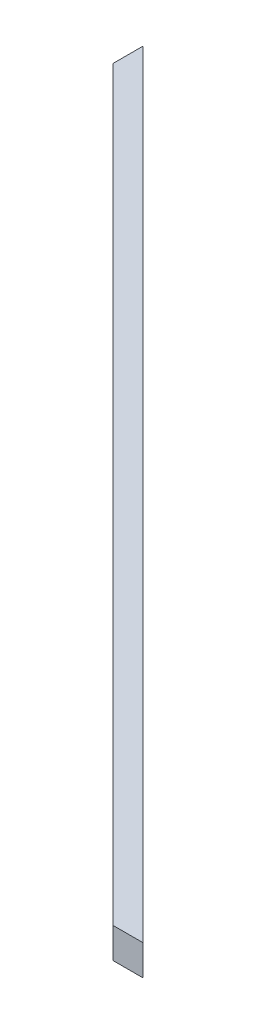
ISO-10303-21;
HEADER;
FILE_DESCRIPTION(('STEP AP214'),'2;1');
FILE_NAME('part.step','',(''),(''),'','','');
FILE_SCHEMA(('AUTOMOTIVE_DESIGN { 1 0 10303 214 1 1 1 1 }'));
ENDSEC;
DATA;
#1=APPLICATION_CONTEXT('core data for automotive mechanical design processes');
#2=APPLICATION_PROTOCOL_DEFINITION('international standard','automotive_design',2000,#1);
#3=PRODUCT_CONTEXT('',#1,'mechanical');
#4=PRODUCT('Part','Part','',(#3));
#5=PRODUCT_RELATED_PRODUCT_CATEGORY('part','',(#4));
#6=PRODUCT_DEFINITION_FORMATION('','',#4);
#7=PRODUCT_DEFINITION_CONTEXT('part definition',#1,'design');
#8=PRODUCT_DEFINITION('design','',#6,#7);
#9=PRODUCT_DEFINITION_SHAPE('','',#8);
#10=(LENGTH_UNIT() NAMED_UNIT(*) SI_UNIT(.MILLI.,.METRE.));
#11=(NAMED_UNIT(*) PLANE_ANGLE_UNIT() SI_UNIT($,.RADIAN.));
#12=(NAMED_UNIT(*) SI_UNIT($,.STERADIAN.) SOLID_ANGLE_UNIT());
#13=UNCERTAINTY_MEASURE_WITH_UNIT(LENGTH_MEASURE(1.E-05),#10,'distance_accuracy_value','');
#14=(GEOMETRIC_REPRESENTATION_CONTEXT(3) GLOBAL_UNCERTAINTY_ASSIGNED_CONTEXT((#13)) GLOBAL_UNIT_ASSIGNED_CONTEXT((#10,
#11,#12)) REPRESENTATION_CONTEXT('',''));
#15=CARTESIAN_POINT('',(0.,0.,0.));
#16=DIRECTION('',(0.,0.,1.));
#17=DIRECTION('',(1.,0.,0.));
#18=AXIS2_PLACEMENT_3D('',#15,#16,#17);
#19=CARTESIAN_POINT('',(-250.,20.,-260.));
#20=DIRECTION('',(1.,0.,0.));
#21=DIRECTION('',(0.,0.,-1.));
#22=AXIS2_PLACEMENT_3D('',#19,#20,#21);
#23=PLANE('',#22);
#24=DIRECTION('',(0.,0.,1.));
#25=VECTOR('',#24,1.);
#26=CARTESIAN_POINT('',(-250.,0.,-260.));
#27=LINE('',#26,#25);
#28=CARTESIAN_POINT('',(-250.,0.,-260.));
#29=VERTEX_POINT('',#28);
#30=CARTESIAN_POINT('',(-250.,0.,-240.));
#31=VERTEX_POINT('',#30);
#32=EDGE_CURVE('E101',#29,#31,#27,.T.);
#33=ORIENTED_EDGE('',*,*,#32,.T.);
#34=DIRECTION('',(0.,-1.,0.));
#35=VECTOR('',#34,1.);
#36=CARTESIAN_POINT('',(-250.,20.,-240.));
#37=LINE('',#36,#35);
#38=CARTESIAN_POINT('',(-250.,20.,-240.));
#39=VERTEX_POINT('',#38);
#40=EDGE_CURVE('E11',#39,#31,#37,.T.);
#41=ORIENTED_EDGE('',*,*,#40,.F.);
#42=DIRECTION('',(0.,0.,1.));
#43=VECTOR('',#42,1.);
#44=CARTESIAN_POINT('',(-250.,20.,-260.));
#45=LINE('',#44,#43);
#46=CARTESIAN_POINT('',(-250.,20.,-260.));
#47=VERTEX_POINT('',#46);
#48=EDGE_CURVE('E89',#47,#39,#45,.T.);
#49=ORIENTED_EDGE('',*,*,#48,.F.);
#50=DIRECTION('',(0.,-1.,0.));
#51=VECTOR('',#50,1.);
#52=CARTESIAN_POINT('',(-250.,20.,-260.));
#53=LINE('',#52,#51);
#54=EDGE_CURVE('E97',#47,#29,#53,.T.);
#55=ORIENTED_EDGE('',*,*,#54,.T.);
#56=EDGE_LOOP('',(#33,#41,#49,#55));
#57=FACE_BOUND('',#56,.T.);
#58=ADVANCED_FACE('F38',(#57),#23,.F.);
#59=CARTESIAN_POINT('',(-250.,20.,-240.));
#60=DIRECTION('',(0.707106781186548,0.,-0.707106781186547));
#61=DIRECTION('',(-0.707106781186547,0.,-0.707106781186548));
#62=AXIS2_PLACEMENT_3D('',#59,#60,#61);
#63=PLANE('',#62);
#64=DIRECTION('',(0.707106781186547,0.,0.707106781186548));
#65=VECTOR('',#64,1.);
#66=CARTESIAN_POINT('',(-250.,0.,-240.));
#67=LINE('',#66,#65);
#68=CARTESIAN_POINT('',(240.,0.,250.));
#69=VERTEX_POINT('',#68);
#70=EDGE_CURVE('E93',#31,#69,#67,.T.);
#71=ORIENTED_EDGE('',*,*,#70,.T.);
#72=DIRECTION('',(0.,-1.,0.));
#73=VECTOR('',#72,1.);
#74=CARTESIAN_POINT('',(240.,20.,250.));
#75=LINE('',#74,#73);
#76=CARTESIAN_POINT('',(240.,20.,250.));
#77=VERTEX_POINT('',#76);
#78=EDGE_CURVE('E46',#77,#69,#75,.T.);
#79=ORIENTED_EDGE('',*,*,#78,.F.);
#80=DIRECTION('',(0.707106781186547,0.,0.707106781186548));
#81=VECTOR('',#80,1.);
#82=CARTESIAN_POINT('',(-250.,20.,-240.));
#83=LINE('',#82,#81);
#84=EDGE_CURVE('E84',#39,#77,#83,.T.);
#85=ORIENTED_EDGE('',*,*,#84,.F.);
#86=ORIENTED_EDGE('',*,*,#40,.T.);
#87=EDGE_LOOP('',(#71,#79,#85,#86));
#88=FACE_BOUND('',#87,.T.);
#89=ADVANCED_FACE('F92',(#88),#63,.F.);
#90=CARTESIAN_POINT('',(240.,20.,250.));
#91=DIRECTION('',(0.,0.,-1.));
#92=DIRECTION('',(-1.,0.,0.));
#93=AXIS2_PLACEMENT_3D('',#90,#91,#92);
#94=PLANE('',#93);
#95=DIRECTION('',(1.,0.,0.));
#96=VECTOR('',#95,1.);
#97=CARTESIAN_POINT('',(240.,0.,250.));
#98=LINE('',#97,#96);
#99=CARTESIAN_POINT('',(260.,0.,250.));
#100=VERTEX_POINT('',#99);
#101=EDGE_CURVE('E71',#69,#100,#98,.T.);
#102=ORIENTED_EDGE('',*,*,#101,.T.);
#103=DIRECTION('',(0.,-1.,0.));
#104=VECTOR('',#103,1.);
#105=CARTESIAN_POINT('',(260.,20.,250.));
#106=LINE('',#105,#104);
#107=CARTESIAN_POINT('',(260.,20.,250.));
#108=VERTEX_POINT('',#107);
#109=EDGE_CURVE('E94',#108,#100,#106,.T.);
#110=ORIENTED_EDGE('',*,*,#109,.F.);
#111=DIRECTION('',(1.,0.,0.));
#112=VECTOR('',#111,1.);
#113=CARTESIAN_POINT('',(240.,20.,250.));
#114=LINE('',#113,#112);
#115=EDGE_CURVE('E87',#77,#108,#114,.T.);
#116=ORIENTED_EDGE('',*,*,#115,.F.);
#117=ORIENTED_EDGE('',*,*,#78,.T.);
#118=EDGE_LOOP('',(#102,#110,#116,#117));
#119=FACE_BOUND('',#118,.T.);
#120=ADVANCED_FACE('F95',(#119),#94,.F.);
#121=CARTESIAN_POINT('',(260.,20.,250.));
#122=DIRECTION('',(-0.707106781186548,0.,0.707106781186547));
#123=DIRECTION('',(0.707106781186547,0.,0.707106781186548));
#124=AXIS2_PLACEMENT_3D('',#121,#122,#123);
#125=PLANE('',#124);
#126=DIRECTION('',(-0.707106781186547,0.,-0.707106781186548));
#127=VECTOR('',#126,1.);
#128=CARTESIAN_POINT('',(260.,0.,250.));
#129=LINE('',#128,#127);
#130=EDGE_CURVE('E77',#100,#29,#129,.T.);
#131=ORIENTED_EDGE('',*,*,#130,.T.);
#132=ORIENTED_EDGE('',*,*,#54,.F.);
#133=DIRECTION('',(-0.707106781186547,0.,-0.707106781186548));
#134=VECTOR('',#133,1.);
#135=CARTESIAN_POINT('',(260.,20.,250.));
#136=LINE('',#135,#134);
#137=EDGE_CURVE('E54',#108,#47,#136,.T.);
#138=ORIENTED_EDGE('',*,*,#137,.F.);
#139=ORIENTED_EDGE('',*,*,#109,.T.);
#140=EDGE_LOOP('',(#131,#132,#138,#139));
#141=FACE_BOUND('',#140,.T.);
#142=ADVANCED_FACE('F108',(#141),#125,.F.);
#143=CARTESIAN_POINT('',(0.,20.,0.));
#144=DIRECTION('',(0.,1.,0.));
#145=DIRECTION('',(0.,0.,1.));
#146=AXIS2_PLACEMENT_3D('',#143,#144,#145);
#147=PLANE('',#146);
#148=ORIENTED_EDGE('',*,*,#48,.T.);
#149=ORIENTED_EDGE('',*,*,#84,.T.);
#150=ORIENTED_EDGE('',*,*,#115,.T.);
#151=ORIENTED_EDGE('',*,*,#137,.T.);
#152=EDGE_LOOP('',(#148,#149,#150,#151));
#153=FACE_BOUND('',#152,.T.);
#154=ADVANCED_FACE('F85',(#153),#147,.T.);
#155=CARTESIAN_POINT('',(0.,0.,0.));
#156=DIRECTION('',(0.,1.,0.));
#157=DIRECTION('',(0.,0.,1.));
#158=AXIS2_PLACEMENT_3D('',#155,#156,#157);
#159=PLANE('',#158);
#160=ORIENTED_EDGE('',*,*,#32,.F.);
#161=ORIENTED_EDGE('',*,*,#130,.F.);
#162=ORIENTED_EDGE('',*,*,#101,.F.);
#163=ORIENTED_EDGE('',*,*,#70,.F.);
#164=EDGE_LOOP('',(#160,#161,#162,#163));
#165=FACE_BOUND('',#164,.T.);
#166=ADVANCED_FACE('F111',(#165),#159,.F.);
#167=CLOSED_SHELL('',(#58,#89,#120,#142,#154,#166));
#168=MANIFOLD_SOLID_BREP('B2',#167);
#169=ADVANCED_BREP_SHAPE_REPRESENTATION('',(#18,#168),#14);
#170=SHAPE_DEFINITION_REPRESENTATION(#9,#169);
ENDSEC;
END-ISO-10303-21;
